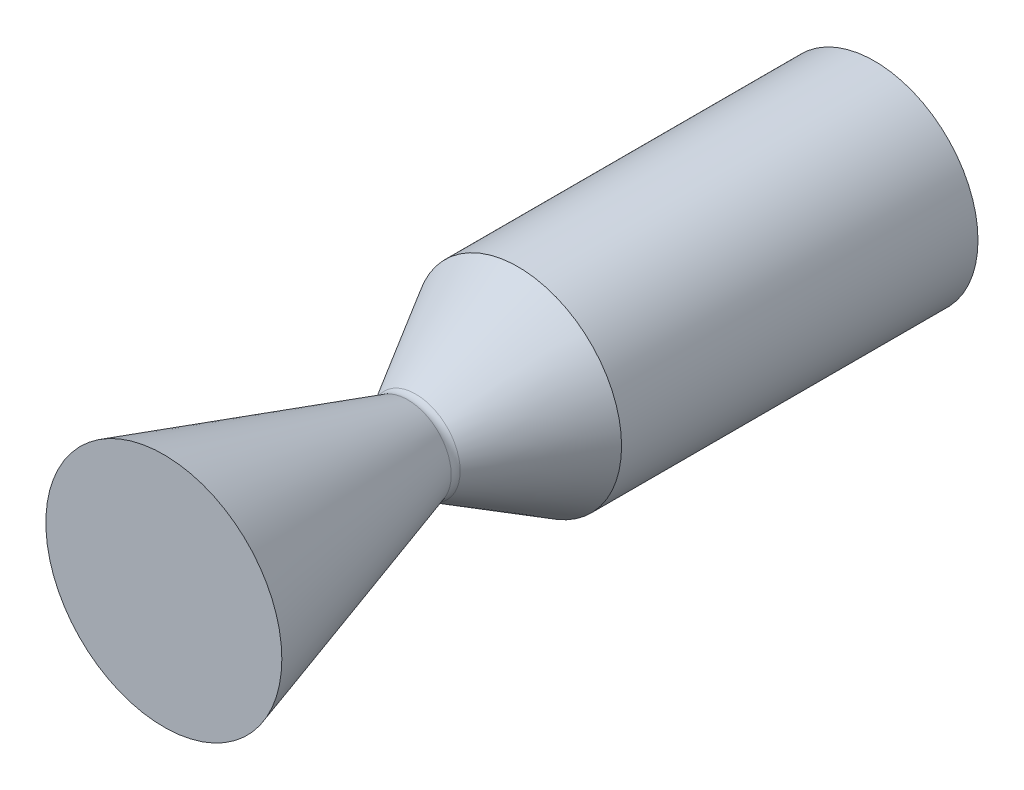
ISO-10303-21;
HEADER;
FILE_DESCRIPTION(('STEP AP214'),'2;1');
FILE_NAME('part.step','',(''),(''),'','','');
FILE_SCHEMA(('AUTOMOTIVE_DESIGN { 1 0 10303 214 1 1 1 1 }'));
ENDSEC;
DATA;
#1=APPLICATION_CONTEXT('core data for automotive mechanical design processes');
#2=APPLICATION_PROTOCOL_DEFINITION('international standard','automotive_design',2000,#1);
#3=PRODUCT_CONTEXT('',#1,'mechanical');
#4=PRODUCT('Part','Part','',(#3));
#5=PRODUCT_RELATED_PRODUCT_CATEGORY('part','',(#4));
#6=PRODUCT_DEFINITION_FORMATION('','',#4);
#7=PRODUCT_DEFINITION_CONTEXT('part definition',#1,'design');
#8=PRODUCT_DEFINITION('design','',#6,#7);
#9=PRODUCT_DEFINITION_SHAPE('','',#8);
#10=(LENGTH_UNIT() NAMED_UNIT(*) SI_UNIT(.MILLI.,.METRE.));
#11=(NAMED_UNIT(*) PLANE_ANGLE_UNIT() SI_UNIT($,.RADIAN.));
#12=(NAMED_UNIT(*) SI_UNIT($,.STERADIAN.) SOLID_ANGLE_UNIT());
#13=UNCERTAINTY_MEASURE_WITH_UNIT(LENGTH_MEASURE(1.E-05),#10,'distance_accuracy_value','');
#14=(GEOMETRIC_REPRESENTATION_CONTEXT(3) GLOBAL_UNCERTAINTY_ASSIGNED_CONTEXT((#13)) GLOBAL_UNIT_ASSIGNED_CONTEXT((#10,
#11,#12)) REPRESENTATION_CONTEXT('',''));
#15=CARTESIAN_POINT('',(0.,0.,0.));
#16=DIRECTION('',(0.,0.,1.));
#17=DIRECTION('',(1.,0.,0.));
#18=AXIS2_PLACEMENT_3D('',#15,#16,#17);
#19=CARTESIAN_POINT('',(0.,0.,98.6480898452624));
#20=DIRECTION('',(0.,0.,1.));
#21=DIRECTION('',(1.,0.,0.));
#22=AXIS2_PLACEMENT_3D('',#19,#20,#21);
#23=CYLINDRICAL_SURFACE('',#22,26.0076810940689);
#24=CARTESIAN_POINT('',(0.,0.,0.680590948775053));
#25=DIRECTION('',(0.,0.,1.));
#26=DIRECTION('',(1.,0.,0.));
#27=AXIS2_PLACEMENT_3D('',#24,#25,#26);
#28=CIRCLE('',#27,26.0076810940689);
#29=CARTESIAN_POINT('',(26.0076810940689,0.,0.680590948775053));
#30=VERTEX_POINT('',#29);
#31=EDGE_CURVE('E59',#30,#30,#28,.T.);
#32=ORIENTED_EDGE('',*,*,#31,.F.);
#33=EDGE_LOOP('',(#32));
#34=FACE_BOUND('',#33,.T.);
#35=CARTESIAN_POINT('',(0.,0.,-88.9));
#36=DIRECTION('',(0.,0.,1.));
#37=DIRECTION('',(1.,0.,0.));
#38=AXIS2_PLACEMENT_3D('',#35,#36,#37);
#39=CIRCLE('',#38,26.0076810940689);
#40=CARTESIAN_POINT('',(26.0076810940689,0.,-88.9));
#41=VERTEX_POINT('',#40);
#42=EDGE_CURVE('E10',#41,#41,#39,.T.);
#43=ORIENTED_EDGE('',*,*,#42,.T.);
#44=EDGE_LOOP('',(#43));
#45=FACE_BOUND('',#44,.T.);
#46=ADVANCED_FACE('F51',(#34,#45),#23,.T.);
#47=CARTESIAN_POINT('',(0.,0.,0.680590948775053));
#48=DIRECTION('',(0.,0.,-1.));
#49=DIRECTION('',(-1.,0.,0.));
#50=AXIS2_PLACEMENT_3D('',#47,#48,#49);
#51=CONICAL_SURFACE('',#50,26.0076810940689,0.523598775598299);
#52=CARTESIAN_POINT('',(0.,0.,26.4023591874235));
#53=DIRECTION('',(0.,0.,1.));
#54=DIRECTION('',(1.,0.,0.));
#55=AXIS2_PLACEMENT_3D('',#52,#53,#54);
#56=CIRCLE('',#55,11.157211277452);
#57=CARTESIAN_POINT('',(11.157211277452,0.,26.4023591874235));
#58=VERTEX_POINT('',#57);
#59=EDGE_CURVE('E67',#58,#58,#56,.T.);
#60=ORIENTED_EDGE('',*,*,#59,.F.);
#61=EDGE_LOOP('',(#60));
#62=FACE_BOUND('',#61,.T.);
#63=ORIENTED_EDGE('',*,*,#31,.T.);
#64=EDGE_LOOP('',(#63));
#65=FACE_BOUND('',#64,.T.);
#66=ADVANCED_FACE('F94',(#62,#65),#51,.T.);
#67=CARTESIAN_POINT('',(0.,0.,27.6723591874235));
#68=DIRECTION('',(0.,0.,1.));
#69=DIRECTION('',(1.,0.,0.));
#70=AXIS2_PLACEMENT_3D('',#67,#68,#69);
#71=TOROIDAL_SURFACE('',#70,13.3569158030645,2.54);
#72=CARTESIAN_POINT('',(0.,0.,28.414485615538));
#73=DIRECTION('',(0.,0.,1.));
#74=DIRECTION('',(1.,0.,0.));
#75=AXIS2_PLACEMENT_3D('',#72,#73,#74);
#76=CIRCLE('',#75,10.9277496159349);
#77=CARTESIAN_POINT('',(10.9277496159349,0.,28.414485615538));
#78=VERTEX_POINT('',#77);
#79=EDGE_CURVE('E73',#78,#78,#76,.T.);
#80=ORIENTED_EDGE('',*,*,#79,.F.);
#81=EDGE_LOOP('',(#80));
#82=FACE_BOUND('',#81,.T.);
#83=ORIENTED_EDGE('',*,*,#59,.T.);
#84=EDGE_LOOP('',(#83));
#85=FACE_BOUND('',#84,.T.);
#86=ADVANCED_FACE('F88',(#82,#85),#71,.F.);
#87=CARTESIAN_POINT('',(0.,0.,88.975101995945));
#88=DIRECTION('',(0.,0.,1.));
#89=DIRECTION('',(1.,0.,0.));
#90=AXIS2_PLACEMENT_3D('',#87,#88,#89);
#91=CONICAL_SURFACE('',#90,29.4294207477522,0.296501080532815);
#92=CARTESIAN_POINT('',(0.,0.,89.7172284240595));
#93=DIRECTION('',(0.,0.,1.));
#94=DIRECTION('',(1.,0.,0.));
#95=AXIS2_PLACEMENT_3D('',#92,#93,#94);
#96=CIRCLE('',#95,29.6561453079013);
#97=CARTESIAN_POINT('',(29.6561453079013,0.,89.7172284240595));
#98=VERTEX_POINT('',#97);
#99=EDGE_CURVE('E78',#98,#98,#96,.T.);
#100=ORIENTED_EDGE('',*,*,#99,.F.);
#101=EDGE_LOOP('',(#100));
#102=FACE_BOUND('',#101,.T.);
#103=ORIENTED_EDGE('',*,*,#79,.T.);
#104=EDGE_LOOP('',(#103));
#105=FACE_BOUND('',#104,.T.);
#106=ADVANCED_FACE('F85',(#102,#105),#91,.T.);
#107=CARTESIAN_POINT('',(0.,0.,89.7172284240595));
#108=DIRECTION('',(0.,0.,1.));
#109=DIRECTION('',(1.,0.,0.));
#110=AXIS2_PLACEMENT_3D('',#107,#108,#109);
#111=PLANE('',#110);
#112=ORIENTED_EDGE('',*,*,#99,.T.);
#113=EDGE_LOOP('',(#112));
#114=FACE_BOUND('',#113,.T.);
#115=ADVANCED_FACE('F83',(#114),#111,.T.);
#116=CARTESIAN_POINT('',(0.,0.,-88.9));
#117=DIRECTION('',(0.,0.,1.));
#118=DIRECTION('',(1.,0.,0.));
#119=AXIS2_PLACEMENT_3D('',#116,#117,#118);
#120=PLANE('',#119);
#121=ORIENTED_EDGE('',*,*,#42,.F.);
#122=EDGE_LOOP('',(#121));
#123=FACE_BOUND('',#122,.T.);
#124=ADVANCED_FACE('F53',(#123),#120,.F.);
#125=CLOSED_SHELL('',(#46,#66,#86,#106,#115,#124));
#126=MANIFOLD_SOLID_BREP('B2',#125);
#127=ADVANCED_BREP_SHAPE_REPRESENTATION('',(#18,#126),#14);
#128=SHAPE_DEFINITION_REPRESENTATION(#9,#127);
ENDSEC;
END-ISO-10303-21;
